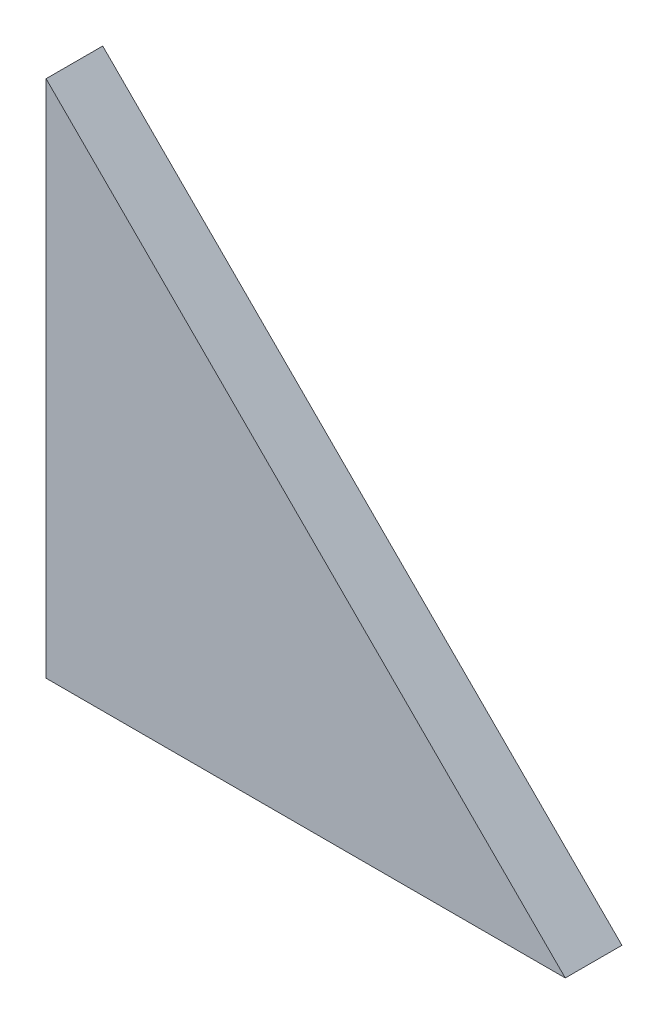
ISO-10303-21;
HEADER;
FILE_DESCRIPTION(('STEP AP214'),'2;1');
FILE_NAME('part.step','',(''),(''),'','','');
FILE_SCHEMA(('AUTOMOTIVE_DESIGN { 1 0 10303 214 1 1 1 1 }'));
ENDSEC;
DATA;
#1=APPLICATION_CONTEXT('core data for automotive mechanical design processes');
#2=APPLICATION_PROTOCOL_DEFINITION('international standard','automotive_design',2000,#1);
#3=PRODUCT_CONTEXT('',#1,'mechanical');
#4=PRODUCT('Part','Part','',(#3));
#5=PRODUCT_RELATED_PRODUCT_CATEGORY('part','',(#4));
#6=PRODUCT_DEFINITION_FORMATION('','',#4);
#7=PRODUCT_DEFINITION_CONTEXT('part definition',#1,'design');
#8=PRODUCT_DEFINITION('design','',#6,#7);
#9=PRODUCT_DEFINITION_SHAPE('','',#8);
#10=(LENGTH_UNIT() NAMED_UNIT(*) SI_UNIT(.MILLI.,.METRE.));
#11=(NAMED_UNIT(*) PLANE_ANGLE_UNIT() SI_UNIT($,.RADIAN.));
#12=(NAMED_UNIT(*) SI_UNIT($,.STERADIAN.) SOLID_ANGLE_UNIT());
#13=UNCERTAINTY_MEASURE_WITH_UNIT(LENGTH_MEASURE(1.E-05),#10,'distance_accuracy_value','');
#14=(GEOMETRIC_REPRESENTATION_CONTEXT(3) GLOBAL_UNCERTAINTY_ASSIGNED_CONTEXT((#13)) GLOBAL_UNIT_ASSIGNED_CONTEXT((#10,
#11,#12)) REPRESENTATION_CONTEXT('',''));
#15=CARTESIAN_POINT('',(0.,0.,0.));
#16=DIRECTION('',(0.,0.,1.));
#17=DIRECTION('',(1.,0.,0.));
#18=AXIS2_PLACEMENT_3D('',#15,#16,#17);
#19=CARTESIAN_POINT('',(1.38777878078145E-13,-4.44089209850063E-13,12.));
#20=DIRECTION('',(1.,0.,0.));
#21=DIRECTION('',(0.,0.,-0.999999999999989));
#22=AXIS2_PLACEMENT_3D('',#19,#20,#21);
#23=PLANE('',#22);
#24=DIRECTION('',(0.,-1.,0.));
#25=VECTOR('',#24,1.);
#26=CARTESIAN_POINT('',(0.,0.,0.));
#27=LINE('',#26,#25);
#28=CARTESIAN_POINT('',(0.,110.,-1.66533453693773E-13));
#29=VERTEX_POINT('',#28);
#30=CARTESIAN_POINT('',(0.,0.,0.));
#31=VERTEX_POINT('',#30);
#32=EDGE_CURVE('E70',#29,#31,#27,.T.);
#33=ORIENTED_EDGE('',*,*,#32,.T.);
#34=DIRECTION('',(0.,0.,-0.999999999999989));
#35=VECTOR('',#34,1.);
#36=CARTESIAN_POINT('',(1.38777878078145E-13,-4.44089209850063E-13,12.));
#37=LINE('',#36,#35);
#38=CARTESIAN_POINT('',(1.38777878078145E-13,-4.44089209850063E-13,12.));
#39=VERTEX_POINT('',#38);
#40=EDGE_CURVE('E11',#39,#31,#37,.T.);
#41=ORIENTED_EDGE('',*,*,#40,.F.);
#42=DIRECTION('',(0.,-1.,0.));
#43=VECTOR('',#42,1.);
#44=CARTESIAN_POINT('',(1.38777878078145E-13,-4.44089209850063E-13,12.));
#45=LINE('',#44,#43);
#46=CARTESIAN_POINT('',(0.,110.,11.9999999999997));
#47=VERTEX_POINT('',#46);
#48=EDGE_CURVE('E84',#47,#39,#45,.T.);
#49=ORIENTED_EDGE('',*,*,#48,.F.);
#50=DIRECTION('',(0.,0.,-0.999999999999989));
#51=VECTOR('',#50,1.);
#52=CARTESIAN_POINT('',(0.,110.,11.9999999999997));
#53=LINE('',#52,#51);
#54=EDGE_CURVE('E80',#47,#29,#53,.T.);
#55=ORIENTED_EDGE('',*,*,#54,.T.);
#56=EDGE_LOOP('',(#33,#41,#49,#55));
#57=FACE_BOUND('',#56,.T.);
#58=ADVANCED_FACE('F34',(#57),#23,.F.);
#59=CARTESIAN_POINT('',(1.38777878078145E-13,-4.44089209850063E-13,12.));
#60=DIRECTION('',(0.,1.,0.));
#61=DIRECTION('',(0.,0.,0.999999999999989));
#62=AXIS2_PLACEMENT_3D('',#59,#60,#61);
#63=PLANE('',#62);
#64=DIRECTION('',(1.,0.,0.));
#65=VECTOR('',#64,1.);
#66=CARTESIAN_POINT('',(0.,0.,0.));
#67=LINE('',#66,#65);
#68=CARTESIAN_POINT('',(110.,-1.11022302462516E-13,-2.22044604925031E-13));
#69=VERTEX_POINT('',#68);
#70=EDGE_CURVE('E67',#31,#69,#67,.T.);
#71=ORIENTED_EDGE('',*,*,#70,.T.);
#72=DIRECTION('',(0.,0.,-0.999999999999989));
#73=VECTOR('',#72,1.);
#74=CARTESIAN_POINT('',(110.,3.05311331771918E-13,12.0000000000003));
#75=LINE('',#74,#73);
#76=CARTESIAN_POINT('',(110.,3.05311331771918E-13,12.0000000000003));
#77=VERTEX_POINT('',#76);
#78=EDGE_CURVE('E41',#77,#69,#75,.T.);
#79=ORIENTED_EDGE('',*,*,#78,.F.);
#80=DIRECTION('',(1.,0.,0.));
#81=VECTOR('',#80,1.);
#82=CARTESIAN_POINT('',(1.38777878078145E-13,-4.44089209850063E-13,12.));
#83=LINE('',#82,#81);
#84=EDGE_CURVE('E52',#39,#77,#83,.T.);
#85=ORIENTED_EDGE('',*,*,#84,.F.);
#86=ORIENTED_EDGE('',*,*,#40,.T.);
#87=EDGE_LOOP('',(#71,#79,#85,#86));
#88=FACE_BOUND('',#87,.T.);
#89=ADVANCED_FACE('F76',(#88),#63,.F.);
#90=CARTESIAN_POINT('',(0.,110.,11.9999999999997));
#91=DIRECTION('',(-0.707106781186548,-0.707106781186548,0.));
#92=DIRECTION('',(0.707106781186548,-0.707106781186548,0.));
#93=AXIS2_PLACEMENT_3D('',#90,#91,#92);
#94=PLANE('',#93);
#95=DIRECTION('',(-0.707106781186548,0.707106781186548,0.));
#96=VECTOR('',#95,1.);
#97=CARTESIAN_POINT('',(0.,110.,-1.66533453693773E-13));
#98=LINE('',#97,#96);
#99=EDGE_CURVE('E71',#69,#29,#98,.T.);
#100=ORIENTED_EDGE('',*,*,#99,.T.);
#101=ORIENTED_EDGE('',*,*,#54,.F.);
#102=DIRECTION('',(-0.707106781186548,0.707106781186548,0.));
#103=VECTOR('',#102,1.);
#104=CARTESIAN_POINT('',(0.,110.,11.9999999999997));
#105=LINE('',#104,#103);
#106=EDGE_CURVE('E48',#77,#47,#105,.T.);
#107=ORIENTED_EDGE('',*,*,#106,.F.);
#108=ORIENTED_EDGE('',*,*,#78,.T.);
#109=EDGE_LOOP('',(#100,#101,#107,#108));
#110=FACE_BOUND('',#109,.T.);
#111=ADVANCED_FACE('F89',(#110),#94,.F.);
#112=CARTESIAN_POINT('',(1.38777878078145E-13,-4.44089209850063E-13,12.));
#113=DIRECTION('',(0.,0.,-0.999999999999989));
#114=DIRECTION('',(-1.,0.,0.));
#115=AXIS2_PLACEMENT_3D('',#112,#113,#114);
#116=PLANE('',#115);
#117=ORIENTED_EDGE('',*,*,#48,.T.);
#118=ORIENTED_EDGE('',*,*,#84,.T.);
#119=ORIENTED_EDGE('',*,*,#106,.T.);
#120=EDGE_LOOP('',(#117,#118,#119));
#121=FACE_BOUND('',#120,.T.);
#122=ADVANCED_FACE('F90',(#121),#116,.F.);
#123=CARTESIAN_POINT('',(0.,0.,0.));
#124=DIRECTION('',(0.,0.,-0.999999999999989));
#125=DIRECTION('',(-1.,0.,0.));
#126=AXIS2_PLACEMENT_3D('',#123,#124,#125);
#127=PLANE('',#126);
#128=ORIENTED_EDGE('',*,*,#32,.F.);
#129=ORIENTED_EDGE('',*,*,#99,.F.);
#130=ORIENTED_EDGE('',*,*,#70,.F.);
#131=EDGE_LOOP('',(#128,#129,#130));
#132=FACE_BOUND('',#131,.T.);
#133=ADVANCED_FACE('F68',(#132),#127,.T.);
#134=CLOSED_SHELL('',(#58,#89,#111,#122,#133));
#135=MANIFOLD_SOLID_BREP('B2',#134);
#136=ADVANCED_BREP_SHAPE_REPRESENTATION('',(#18,#135),#14);
#137=SHAPE_DEFINITION_REPRESENTATION(#9,#136);
ENDSEC;
END-ISO-10303-21;
